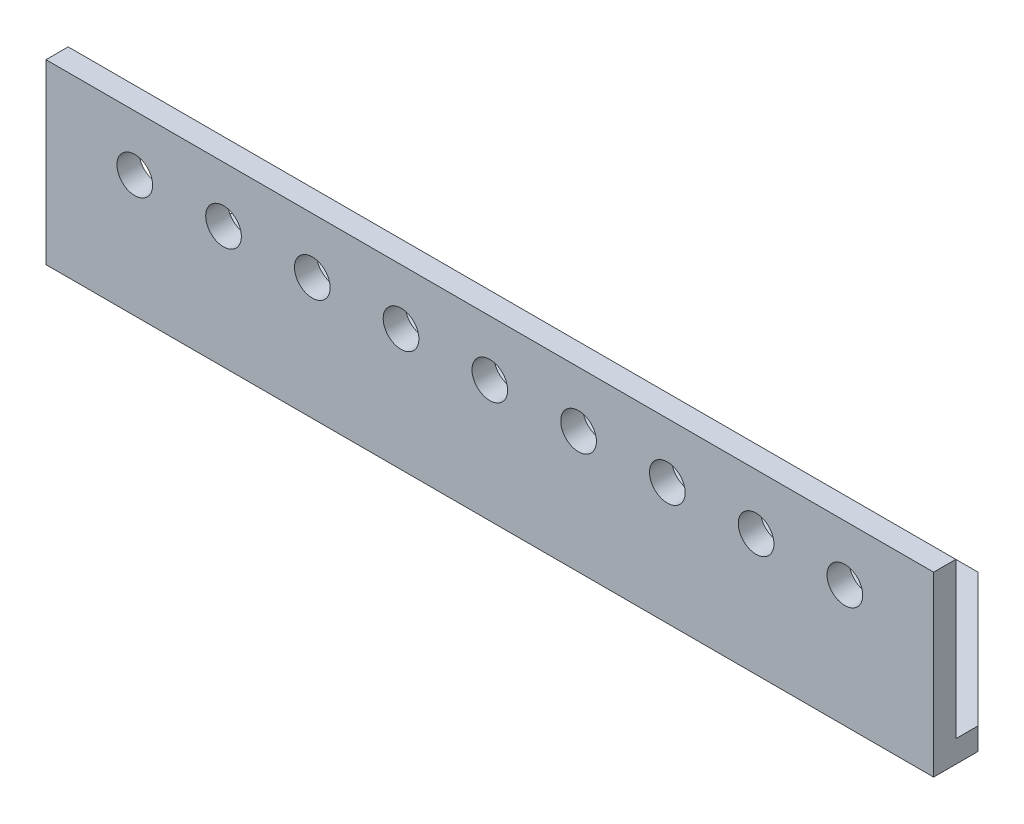
ISO-10303-21;
HEADER;
FILE_DESCRIPTION(('STEP AP214'),'2;1');
FILE_NAME('part.step','',(''),(''),'','','');
FILE_SCHEMA(('AUTOMOTIVE_DESIGN { 1 0 10303 214 1 1 1 1 }'));
ENDSEC;
DATA;
#1=APPLICATION_CONTEXT('core data for automotive mechanical design processes');
#2=APPLICATION_PROTOCOL_DEFINITION('international standard','automotive_design',2000,#1);
#3=PRODUCT_CONTEXT('',#1,'mechanical');
#4=PRODUCT('Part','Part','',(#3));
#5=PRODUCT_RELATED_PRODUCT_CATEGORY('part','',(#4));
#6=PRODUCT_DEFINITION_FORMATION('','',#4);
#7=PRODUCT_DEFINITION_CONTEXT('part definition',#1,'design');
#8=PRODUCT_DEFINITION('design','',#6,#7);
#9=PRODUCT_DEFINITION_SHAPE('','',#8);
#10=(LENGTH_UNIT() NAMED_UNIT(*) SI_UNIT(.MILLI.,.METRE.));
#11=(NAMED_UNIT(*) PLANE_ANGLE_UNIT() SI_UNIT($,.RADIAN.));
#12=(NAMED_UNIT(*) SI_UNIT($,.STERADIAN.) SOLID_ANGLE_UNIT());
#13=UNCERTAINTY_MEASURE_WITH_UNIT(LENGTH_MEASURE(1.E-05),#10,'distance_accuracy_value','');
#14=(GEOMETRIC_REPRESENTATION_CONTEXT(3) GLOBAL_UNCERTAINTY_ASSIGNED_CONTEXT((#13)) GLOBAL_UNIT_ASSIGNED_CONTEXT((#10,
#11,#12)) REPRESENTATION_CONTEXT('',''));
#15=CARTESIAN_POINT('',(0.,0.,0.));
#16=DIRECTION('',(0.,0.,1.));
#17=DIRECTION('',(1.,0.,0.));
#18=AXIS2_PLACEMENT_3D('',#15,#16,#17);
#19=CARTESIAN_POINT('',(0.,3.175,0.));
#20=DIRECTION('',(0.,1.,0.));
#21=DIRECTION('',(0.,0.,1.));
#22=AXIS2_PLACEMENT_3D('',#19,#20,#21);
#23=PLANE('',#22);
#24=DIRECTION('',(0.707106781186548,0.,-0.707106781186547));
#25=VECTOR('',#24,1.);
#26=CARTESIAN_POINT('',(-38.1,3.175,-12.6999999999997));
#27=LINE('',#26,#25);
#28=CARTESIAN_POINT('',(-57.15,3.175,6.35000000000027));
#29=VERTEX_POINT('',#28);
#30=CARTESIAN_POINT('',(-38.1,3.175,-12.6999999999997));
#31=VERTEX_POINT('',#30);
#32=EDGE_CURVE('E54',#29,#31,#27,.T.);
#33=ORIENTED_EDGE('',*,*,#32,.F.);
#34=DIRECTION('',(0.,0.,1.));
#35=VECTOR('',#34,1.);
#36=CARTESIAN_POINT('',(-57.15,3.175,-12.6999999999997));
#37=LINE('',#36,#35);
#38=CARTESIAN_POINT('',(-57.15,3.175,9.52500000000027));
#39=VERTEX_POINT('',#38);
#40=EDGE_CURVE('E117',#29,#39,#37,.T.);
#41=ORIENTED_EDGE('',*,*,#40,.T.);
#42=DIRECTION('',(1.,0.,0.));
#43=VECTOR('',#42,1.);
#44=CARTESIAN_POINT('',(-57.15,3.175,9.52500000000027));
#45=LINE('',#44,#43);
#46=CARTESIAN_POINT('',(69.85,3.175,9.52500000000027));
#47=VERTEX_POINT('',#46);
#48=EDGE_CURVE('E210',#39,#47,#45,.T.);
#49=ORIENTED_EDGE('',*,*,#48,.T.);
#50=DIRECTION('',(0.,0.,-1.));
#51=VECTOR('',#50,1.);
#52=CARTESIAN_POINT('',(69.85,3.175,-12.6999999999997));
#53=LINE('',#52,#51);
#54=CARTESIAN_POINT('',(69.85,3.175,6.35000000000027));
#55=VERTEX_POINT('',#54);
#56=EDGE_CURVE('E141',#47,#55,#53,.T.);
#57=ORIENTED_EDGE('',*,*,#56,.T.);
#58=DIRECTION('',(0.707106781186547,0.,0.707106781186547));
#59=VECTOR('',#58,1.);
#60=CARTESIAN_POINT('',(50.8,3.175,-12.6999999999997));
#61=LINE('',#60,#59);
#62=CARTESIAN_POINT('',(50.8,3.175,-12.6999999999997));
#63=VERTEX_POINT('',#62);
#64=EDGE_CURVE('E267',#63,#55,#61,.T.);
#65=ORIENTED_EDGE('',*,*,#64,.F.);
#66=DIRECTION('',(-1.,0.,0.));
#67=VECTOR('',#66,1.);
#68=CARTESIAN_POINT('',(-57.15,3.175,-12.6999999999997));
#69=LINE('',#68,#67);
#70=EDGE_CURVE('E131',#63,#31,#69,.T.);
#71=ORIENTED_EDGE('',*,*,#70,.T.);
#72=EDGE_LOOP('',(#33,#41,#49,#57,#65,#71));
#73=FACE_BOUND('',#72,.T.);
#74=CARTESIAN_POINT('',(-38.1,3.175,2.66050878019847E-13));
#75=DIRECTION('',(0.,1.,0.));
#76=DIRECTION('',(0.,0.,1.));
#77=AXIS2_PLACEMENT_3D('',#74,#75,#76);
#78=CIRCLE('',#77,2.5527);
#79=CARTESIAN_POINT('',(-38.1,3.175,2.55270000000026));
#80=VERTEX_POINT('',#79);
#81=EDGE_CURVE('E180',#80,#80,#78,.T.);
#82=ORIENTED_EDGE('',*,*,#81,.F.);
#83=EDGE_LOOP('',(#82));
#84=FACE_BOUND('',#83,.T.);
#85=CARTESIAN_POINT('',(-12.7,3.175,0.));
#86=DIRECTION('',(0.,1.,0.));
#87=DIRECTION('',(0.,0.,1.));
#88=AXIS2_PLACEMENT_3D('',#85,#86,#87);
#89=CIRCLE('',#88,2.5527);
#90=CARTESIAN_POINT('',(-12.7,3.175,2.55270000000009));
#91=VERTEX_POINT('',#90);
#92=EDGE_CURVE('E168',#91,#91,#89,.T.);
#93=ORIENTED_EDGE('',*,*,#92,.F.);
#94=EDGE_LOOP('',(#93));
#95=FACE_BOUND('',#94,.T.);
#96=CARTESIAN_POINT('',(25.4,3.175,0.));
#97=DIRECTION('',(0.,1.,0.));
#98=DIRECTION('',(0.,0.,1.));
#99=AXIS2_PLACEMENT_3D('',#96,#97,#98);
#100=CIRCLE('',#99,2.5527);
#101=CARTESIAN_POINT('',(25.4,3.175,2.5527));
#102=VERTEX_POINT('',#101);
#103=EDGE_CURVE('E156',#102,#102,#100,.T.);
#104=ORIENTED_EDGE('',*,*,#103,.F.);
#105=EDGE_LOOP('',(#104));
#106=FACE_BOUND('',#105,.T.);
#107=CARTESIAN_POINT('',(0.,3.175,0.));
#108=DIRECTION('',(0.,1.,0.));
#109=DIRECTION('',(0.,0.,1.));
#110=AXIS2_PLACEMENT_3D('',#107,#108,#109);
#111=CIRCLE('',#110,2.5527);
#112=CARTESIAN_POINT('',(0.,3.175,2.5527));
#113=VERTEX_POINT('',#112);
#114=EDGE_CURVE('E123',#113,#113,#111,.T.);
#115=ORIENTED_EDGE('',*,*,#114,.F.);
#116=EDGE_LOOP('',(#115));
#117=FACE_BOUND('',#116,.T.);
#118=CARTESIAN_POINT('',(12.7,3.175,0.));
#119=DIRECTION('',(0.,1.,0.));
#120=DIRECTION('',(0.,0.,1.));
#121=AXIS2_PLACEMENT_3D('',#118,#119,#120);
#122=CIRCLE('',#121,2.5527);
#123=CARTESIAN_POINT('',(12.7,3.175,2.5527));
#124=VERTEX_POINT('',#123);
#125=EDGE_CURVE('E151',#124,#124,#122,.T.);
#126=ORIENTED_EDGE('',*,*,#125,.F.);
#127=EDGE_LOOP('',(#126));
#128=FACE_BOUND('',#127,.T.);
#129=CARTESIAN_POINT('',(38.1,3.175,0.));
#130=DIRECTION('',(0.,1.,0.));
#131=DIRECTION('',(0.,0.,1.));
#132=AXIS2_PLACEMENT_3D('',#129,#130,#131);
#133=CIRCLE('',#132,2.5527);
#134=CARTESIAN_POINT('',(38.1,3.175,2.5527));
#135=VERTEX_POINT('',#134);
#136=EDGE_CURVE('E162',#135,#135,#133,.T.);
#137=ORIENTED_EDGE('',*,*,#136,.F.);
#138=EDGE_LOOP('',(#137));
#139=FACE_BOUND('',#138,.T.);
#140=CARTESIAN_POINT('',(-25.4,3.175,1.77367252013231E-13));
#141=DIRECTION('',(0.,1.,0.));
#142=DIRECTION('',(0.,0.,1.));
#143=AXIS2_PLACEMENT_3D('',#140,#141,#142);
#144=CIRCLE('',#143,2.5527);
#145=CARTESIAN_POINT('',(-25.4,3.175,2.55270000000018));
#146=VERTEX_POINT('',#145);
#147=EDGE_CURVE('E174',#146,#146,#144,.T.);
#148=ORIENTED_EDGE('',*,*,#147,.F.);
#149=EDGE_LOOP('',(#148));
#150=FACE_BOUND('',#149,.T.);
#151=CARTESIAN_POINT('',(50.8,3.175,0.));
#152=DIRECTION('',(0.,1.,0.));
#153=DIRECTION('',(0.,0.,1.));
#154=AXIS2_PLACEMENT_3D('',#151,#152,#153);
#155=CIRCLE('',#154,2.5527);
#156=CARTESIAN_POINT('',(50.8,3.175,2.5527));
#157=VERTEX_POINT('',#156);
#158=EDGE_CURVE('E186',#157,#157,#155,.T.);
#159=ORIENTED_EDGE('',*,*,#158,.F.);
#160=EDGE_LOOP('',(#159));
#161=FACE_BOUND('',#160,.T.);
#162=ADVANCED_FACE('F39',(#73,#84,#95,#106,#117,#128,#139,#150,#161),#23,.T.);
#163=CARTESIAN_POINT('',(0.,0.,0.));
#164=DIRECTION('',(0.,1.,0.));
#165=DIRECTION('',(0.,0.,1.));
#166=AXIS2_PLACEMENT_3D('',#163,#164,#165);
#167=PLANE('',#166);
#168=DIRECTION('',(0.,0.,1.));
#169=VECTOR('',#168,1.);
#170=CARTESIAN_POINT('',(-57.15,0.,-12.6999999999997));
#171=LINE('',#170,#169);
#172=CARTESIAN_POINT('',(-57.15,0.,6.35000000000027));
#173=VERTEX_POINT('',#172);
#174=CARTESIAN_POINT('',(-57.15,0.,12.7000000000003));
#175=VERTEX_POINT('',#174);
#176=EDGE_CURVE('E114',#173,#175,#171,.T.);
#177=ORIENTED_EDGE('',*,*,#176,.F.);
#178=DIRECTION('',(0.707106781186548,0.,-0.707106781186547));
#179=VECTOR('',#178,1.);
#180=CARTESIAN_POINT('',(-38.1,0.,-12.6999999999997));
#181=LINE('',#180,#179);
#182=CARTESIAN_POINT('',(-38.1,0.,-12.6999999999997));
#183=VERTEX_POINT('',#182);
#184=EDGE_CURVE('E102',#173,#183,#181,.T.);
#185=ORIENTED_EDGE('',*,*,#184,.T.);
#186=DIRECTION('',(-1.,0.,0.));
#187=VECTOR('',#186,1.);
#188=CARTESIAN_POINT('',(-57.15,0.,-12.6999999999997));
#189=LINE('',#188,#187);
#190=CARTESIAN_POINT('',(50.8,0.,-12.6999999999997));
#191=VERTEX_POINT('',#190);
#192=EDGE_CURVE('E136',#191,#183,#189,.T.);
#193=ORIENTED_EDGE('',*,*,#192,.F.);
#194=DIRECTION('',(0.707106781186547,0.,0.707106781186547));
#195=VECTOR('',#194,1.);
#196=CARTESIAN_POINT('',(50.8,0.,-12.6999999999997));
#197=LINE('',#196,#195);
#198=CARTESIAN_POINT('',(69.85,0.,6.35000000000027));
#199=VERTEX_POINT('',#198);
#200=EDGE_CURVE('E62',#191,#199,#197,.T.);
#201=ORIENTED_EDGE('',*,*,#200,.T.);
#202=DIRECTION('',(0.,0.,-1.));
#203=VECTOR('',#202,1.);
#204=CARTESIAN_POINT('',(69.85,0.,-12.6999999999997));
#205=LINE('',#204,#203);
#206=CARTESIAN_POINT('',(69.85,0.,12.7000000000003));
#207=VERTEX_POINT('',#206);
#208=EDGE_CURVE('E125',#207,#199,#205,.T.);
#209=ORIENTED_EDGE('',*,*,#208,.F.);
#210=DIRECTION('',(1.,0.,0.));
#211=VECTOR('',#210,1.);
#212=CARTESIAN_POINT('',(-57.15,0.,12.7000000000003));
#213=LINE('',#212,#211);
#214=EDGE_CURVE('E122',#175,#207,#213,.T.);
#215=ORIENTED_EDGE('',*,*,#214,.F.);
#216=EDGE_LOOP('',(#177,#185,#193,#201,#209,#215));
#217=FACE_BOUND('',#216,.T.);
#218=CARTESIAN_POINT('',(0.,0.,0.));
#219=DIRECTION('',(0.,1.,0.));
#220=DIRECTION('',(0.,0.,1.));
#221=AXIS2_PLACEMENT_3D('',#218,#219,#220);
#222=CIRCLE('',#221,2.5527);
#223=CARTESIAN_POINT('',(0.,0.,2.5527));
#224=VERTEX_POINT('',#223);
#225=EDGE_CURVE('E128',#224,#224,#222,.T.);
#226=ORIENTED_EDGE('',*,*,#225,.T.);
#227=EDGE_LOOP('',(#226));
#228=FACE_BOUND('',#227,.T.);
#229=CARTESIAN_POINT('',(12.7,0.,0.));
#230=DIRECTION('',(0.,1.,0.));
#231=DIRECTION('',(0.,0.,1.));
#232=AXIS2_PLACEMENT_3D('',#229,#230,#231);
#233=CIRCLE('',#232,2.5527);
#234=CARTESIAN_POINT('',(12.7,0.,2.5527));
#235=VERTEX_POINT('',#234);
#236=EDGE_CURVE('E153',#235,#235,#233,.T.);
#237=ORIENTED_EDGE('',*,*,#236,.T.);
#238=EDGE_LOOP('',(#237));
#239=FACE_BOUND('',#238,.T.);
#240=CARTESIAN_POINT('',(25.4,0.,0.));
#241=DIRECTION('',(0.,1.,0.));
#242=DIRECTION('',(0.,0.,1.));
#243=AXIS2_PLACEMENT_3D('',#240,#241,#242);
#244=CIRCLE('',#243,2.5527);
#245=CARTESIAN_POINT('',(25.4,0.,2.5527));
#246=VERTEX_POINT('',#245);
#247=EDGE_CURVE('E159',#246,#246,#244,.T.);
#248=ORIENTED_EDGE('',*,*,#247,.T.);
#249=EDGE_LOOP('',(#248));
#250=FACE_BOUND('',#249,.T.);
#251=CARTESIAN_POINT('',(38.1,0.,0.));
#252=DIRECTION('',(0.,1.,0.));
#253=DIRECTION('',(0.,0.,1.));
#254=AXIS2_PLACEMENT_3D('',#251,#252,#253);
#255=CIRCLE('',#254,2.5527);
#256=CARTESIAN_POINT('',(38.1,0.,2.5527));
#257=VERTEX_POINT('',#256);
#258=EDGE_CURVE('E165',#257,#257,#255,.T.);
#259=ORIENTED_EDGE('',*,*,#258,.T.);
#260=EDGE_LOOP('',(#259));
#261=FACE_BOUND('',#260,.T.);
#262=CARTESIAN_POINT('',(-12.7,0.,0.));
#263=DIRECTION('',(0.,1.,0.));
#264=DIRECTION('',(0.,0.,1.));
#265=AXIS2_PLACEMENT_3D('',#262,#263,#264);
#266=CIRCLE('',#265,2.5527);
#267=CARTESIAN_POINT('',(-12.7,0.,2.55270000000009));
#268=VERTEX_POINT('',#267);
#269=EDGE_CURVE('E171',#268,#268,#266,.T.);
#270=ORIENTED_EDGE('',*,*,#269,.T.);
#271=EDGE_LOOP('',(#270));
#272=FACE_BOUND('',#271,.T.);
#273=CARTESIAN_POINT('',(-25.4,0.,1.77367252013231E-13));
#274=DIRECTION('',(0.,1.,0.));
#275=DIRECTION('',(0.,0.,1.));
#276=AXIS2_PLACEMENT_3D('',#273,#274,#275);
#277=CIRCLE('',#276,2.5527);
#278=CARTESIAN_POINT('',(-25.4,0.,2.55270000000018));
#279=VERTEX_POINT('',#278);
#280=EDGE_CURVE('E177',#279,#279,#277,.T.);
#281=ORIENTED_EDGE('',*,*,#280,.T.);
#282=EDGE_LOOP('',(#281));
#283=FACE_BOUND('',#282,.T.);
#284=CARTESIAN_POINT('',(-38.1,0.,2.66050878019847E-13));
#285=DIRECTION('',(0.,1.,0.));
#286=DIRECTION('',(0.,0.,1.));
#287=AXIS2_PLACEMENT_3D('',#284,#285,#286);
#288=CIRCLE('',#287,2.5527);
#289=CARTESIAN_POINT('',(-38.1,0.,2.55270000000026));
#290=VERTEX_POINT('',#289);
#291=EDGE_CURVE('E183',#290,#290,#288,.T.);
#292=ORIENTED_EDGE('',*,*,#291,.T.);
#293=EDGE_LOOP('',(#292));
#294=FACE_BOUND('',#293,.T.);
#295=CARTESIAN_POINT('',(50.8,0.,0.));
#296=DIRECTION('',(0.,1.,0.));
#297=DIRECTION('',(0.,0.,1.));
#298=AXIS2_PLACEMENT_3D('',#295,#296,#297);
#299=CIRCLE('',#298,2.5527);
#300=CARTESIAN_POINT('',(50.8,0.,2.5527));
#301=VERTEX_POINT('',#300);
#302=EDGE_CURVE('E189',#301,#301,#299,.T.);
#303=ORIENTED_EDGE('',*,*,#302,.T.);
#304=EDGE_LOOP('',(#303));
#305=FACE_BOUND('',#304,.T.);
#306=ADVANCED_FACE('F119',(#217,#228,#239,#250,#261,#272,#283,#294,#305),#167,.F.);
#307=CARTESIAN_POINT('',(-57.15,3.175,-12.6999999999997));
#308=DIRECTION('',(1.,0.,0.));
#309=DIRECTION('',(0.,0.,-1.));
#310=AXIS2_PLACEMENT_3D('',#307,#308,#309);
#311=PLANE('',#310);
#312=ORIENTED_EDGE('',*,*,#40,.F.);
#313=DIRECTION('',(0.,1.,0.));
#314=VECTOR('',#313,1.);
#315=CARTESIAN_POINT('',(-57.15,0.,6.35000000000027));
#316=LINE('',#315,#314);
#317=EDGE_CURVE('E105',#173,#29,#316,.T.);
#318=ORIENTED_EDGE('',*,*,#317,.F.);
#319=ORIENTED_EDGE('',*,*,#176,.T.);
#320=DIRECTION('',(0.,-1.,0.));
#321=VECTOR('',#320,1.);
#322=CARTESIAN_POINT('',(-57.15,3.175,12.7000000000003));
#323=LINE('',#322,#321);
#324=CARTESIAN_POINT('',(-57.15,25.4,12.7000000000003));
#325=VERTEX_POINT('',#324);
#326=EDGE_CURVE('E11',#325,#175,#323,.T.);
#327=ORIENTED_EDGE('',*,*,#326,.F.);
#328=DIRECTION('',(0.,0.,1.));
#329=VECTOR('',#328,1.);
#330=CARTESIAN_POINT('',(-57.15,25.4,9.52500000000027));
#331=LINE('',#330,#329);
#332=CARTESIAN_POINT('',(-57.15,25.4,9.52500000000027));
#333=VERTEX_POINT('',#332);
#334=EDGE_CURVE('E192',#333,#325,#331,.T.);
#335=ORIENTED_EDGE('',*,*,#334,.F.);
#336=DIRECTION('',(0.,-1.,0.));
#337=VECTOR('',#336,1.);
#338=CARTESIAN_POINT('',(-57.15,3.175,9.52500000000027));
#339=LINE('',#338,#337);
#340=EDGE_CURVE('E203',#333,#39,#339,.T.);
#341=ORIENTED_EDGE('',*,*,#340,.T.);
#342=EDGE_LOOP('',(#312,#318,#319,#327,#335,#341));
#343=FACE_BOUND('',#342,.T.);
#344=ADVANCED_FACE('F41',(#343),#311,.F.);
#345=CARTESIAN_POINT('',(-57.15,3.175,12.7000000000003));
#346=DIRECTION('',(0.,0.,-1.));
#347=DIRECTION('',(-1.,0.,0.));
#348=AXIS2_PLACEMENT_3D('',#345,#346,#347);
#349=PLANE('',#348);
#350=ORIENTED_EDGE('',*,*,#214,.T.);
#351=DIRECTION('',(0.,-1.,0.));
#352=VECTOR('',#351,1.);
#353=CARTESIAN_POINT('',(69.85,3.175,12.7000000000003));
#354=LINE('',#353,#352);
#355=CARTESIAN_POINT('',(69.85,25.4,12.7000000000003));
#356=VERTEX_POINT('',#355);
#357=EDGE_CURVE('E47',#356,#207,#354,.T.);
#358=ORIENTED_EDGE('',*,*,#357,.F.);
#359=DIRECTION('',(-1.,0.,0.));
#360=VECTOR('',#359,1.);
#361=CARTESIAN_POINT('',(-57.15,25.4,12.7000000000003));
#362=LINE('',#361,#360);
#363=EDGE_CURVE('E200',#356,#325,#362,.T.);
#364=ORIENTED_EDGE('',*,*,#363,.T.);
#365=ORIENTED_EDGE('',*,*,#326,.T.);
#366=EDGE_LOOP('',(#350,#358,#364,#365));
#367=FACE_BOUND('',#366,.T.);
#368=CARTESIAN_POINT('',(-6.35,17.4625,12.7000000000003));
#369=DIRECTION('',(0.,0.,1.));
#370=DIRECTION('',(-1.,0.,0.));
#371=AXIS2_PLACEMENT_3D('',#368,#369,#370);
#372=CIRCLE('',#371,2.5527);
#373=CARTESIAN_POINT('',(-8.90270000000001,17.4625,12.7000000000003));
#374=VERTEX_POINT('',#373);
#375=EDGE_CURVE('E261',#374,#374,#372,.T.);
#376=ORIENTED_EDGE('',*,*,#375,.F.);
#377=EDGE_LOOP('',(#376));
#378=FACE_BOUND('',#377,.T.);
#379=CARTESIAN_POINT('',(-19.05,17.4625,12.7000000000003));
#380=DIRECTION('',(0.,0.,1.));
#381=DIRECTION('',(-1.,0.,0.));
#382=AXIS2_PLACEMENT_3D('',#379,#380,#381);
#383=CIRCLE('',#382,2.5527);
#384=CARTESIAN_POINT('',(-21.6027,17.4625,12.7000000000003));
#385=VERTEX_POINT('',#384);
#386=EDGE_CURVE('E255',#385,#385,#383,.T.);
#387=ORIENTED_EDGE('',*,*,#386,.F.);
#388=EDGE_LOOP('',(#387));
#389=FACE_BOUND('',#388,.T.);
#390=CARTESIAN_POINT('',(-31.75,17.4625,12.7000000000003));
#391=DIRECTION('',(0.,0.,1.));
#392=DIRECTION('',(-1.,0.,0.));
#393=AXIS2_PLACEMENT_3D('',#390,#391,#392);
#394=CIRCLE('',#393,2.5527);
#395=CARTESIAN_POINT('',(-34.3027,17.4625,12.7000000000003));
#396=VERTEX_POINT('',#395);
#397=EDGE_CURVE('E249',#396,#396,#394,.T.);
#398=ORIENTED_EDGE('',*,*,#397,.F.);
#399=EDGE_LOOP('',(#398));
#400=FACE_BOUND('',#399,.T.);
#401=CARTESIAN_POINT('',(-44.45,17.4625,12.7000000000003));
#402=DIRECTION('',(0.,0.,1.));
#403=DIRECTION('',(-1.,0.,0.));
#404=AXIS2_PLACEMENT_3D('',#401,#402,#403);
#405=CIRCLE('',#404,2.5527);
#406=CARTESIAN_POINT('',(-47.0027,17.4625,12.7000000000003));
#407=VERTEX_POINT('',#406);
#408=EDGE_CURVE('E243',#407,#407,#405,.T.);
#409=ORIENTED_EDGE('',*,*,#408,.F.);
#410=EDGE_LOOP('',(#409));
#411=FACE_BOUND('',#410,.T.);
#412=CARTESIAN_POINT('',(57.15,17.4625,12.7000000000003));
#413=DIRECTION('',(0.,0.,1.));
#414=DIRECTION('',(1.,0.,0.));
#415=AXIS2_PLACEMENT_3D('',#412,#413,#414);
#416=CIRCLE('',#415,2.5527);
#417=CARTESIAN_POINT('',(59.7027,17.4625,12.7000000000003));
#418=VERTEX_POINT('',#417);
#419=EDGE_CURVE('E237',#418,#418,#416,.T.);
#420=ORIENTED_EDGE('',*,*,#419,.F.);
#421=EDGE_LOOP('',(#420));
#422=FACE_BOUND('',#421,.T.);
#423=CARTESIAN_POINT('',(44.45,17.4625,12.7000000000003));
#424=DIRECTION('',(0.,0.,1.));
#425=DIRECTION('',(1.,0.,0.));
#426=AXIS2_PLACEMENT_3D('',#423,#424,#425);
#427=CIRCLE('',#426,2.5527);
#428=CARTESIAN_POINT('',(47.0027,17.4625,12.7000000000003));
#429=VERTEX_POINT('',#428);
#430=EDGE_CURVE('E231',#429,#429,#427,.T.);
#431=ORIENTED_EDGE('',*,*,#430,.F.);
#432=EDGE_LOOP('',(#431));
#433=FACE_BOUND('',#432,.T.);
#434=CARTESIAN_POINT('',(19.05,17.4625,12.7000000000003));
#435=DIRECTION('',(0.,0.,1.));
#436=DIRECTION('',(1.,0.,0.));
#437=AXIS2_PLACEMENT_3D('',#434,#435,#436);
#438=CIRCLE('',#437,2.5527);
#439=CARTESIAN_POINT('',(21.6027,17.4625,12.7000000000003));
#440=VERTEX_POINT('',#439);
#441=EDGE_CURVE('E225',#440,#440,#438,.T.);
#442=ORIENTED_EDGE('',*,*,#441,.F.);
#443=EDGE_LOOP('',(#442));
#444=FACE_BOUND('',#443,.T.);
#445=CARTESIAN_POINT('',(31.75,17.4625,12.7000000000003));
#446=DIRECTION('',(0.,0.,1.));
#447=DIRECTION('',(1.,0.,0.));
#448=AXIS2_PLACEMENT_3D('',#445,#446,#447);
#449=CIRCLE('',#448,2.5527);
#450=CARTESIAN_POINT('',(34.3027,17.4625,12.7000000000003));
#451=VERTEX_POINT('',#450);
#452=EDGE_CURVE('E219',#451,#451,#449,.T.);
#453=ORIENTED_EDGE('',*,*,#452,.F.);
#454=EDGE_LOOP('',(#453));
#455=FACE_BOUND('',#454,.T.);
#456=CARTESIAN_POINT('',(6.35,17.4625,12.7000000000003));
#457=DIRECTION('',(0.,0.,1.));
#458=DIRECTION('',(1.,0.,0.));
#459=AXIS2_PLACEMENT_3D('',#456,#457,#458);
#460=CIRCLE('',#459,2.5527);
#461=CARTESIAN_POINT('',(8.9027,17.4625,12.7000000000003));
#462=VERTEX_POINT('',#461);
#463=EDGE_CURVE('E213',#462,#462,#460,.T.);
#464=ORIENTED_EDGE('',*,*,#463,.F.);
#465=EDGE_LOOP('',(#464));
#466=FACE_BOUND('',#465,.T.);
#467=ADVANCED_FACE('F311',(#367,#378,#389,#400,#411,#422,#433,#444,#455,#466),#349,.F.);
#468=CARTESIAN_POINT('',(69.85,3.175,-12.6999999999997));
#469=DIRECTION('',(-1.,0.,0.));
#470=DIRECTION('',(0.,0.,1.));
#471=AXIS2_PLACEMENT_3D('',#468,#469,#470);
#472=PLANE('',#471);
#473=ORIENTED_EDGE('',*,*,#208,.T.);
#474=DIRECTION('',(0.,1.,0.));
#475=VECTOR('',#474,1.);
#476=CARTESIAN_POINT('',(69.85,0.,6.35000000000027));
#477=LINE('',#476,#475);
#478=EDGE_CURVE('E270',#199,#55,#477,.T.);
#479=ORIENTED_EDGE('',*,*,#478,.T.);
#480=ORIENTED_EDGE('',*,*,#56,.F.);
#481=DIRECTION('',(0.,1.,0.));
#482=VECTOR('',#481,1.);
#483=CARTESIAN_POINT('',(69.85,3.175,9.52500000000027));
#484=LINE('',#483,#482);
#485=CARTESIAN_POINT('',(69.85,25.4,9.52500000000027));
#486=VERTEX_POINT('',#485);
#487=EDGE_CURVE('E207',#47,#486,#484,.T.);
#488=ORIENTED_EDGE('',*,*,#487,.T.);
#489=DIRECTION('',(0.,0.,1.));
#490=VECTOR('',#489,1.);
#491=CARTESIAN_POINT('',(69.85,25.4,9.52500000000027));
#492=LINE('',#491,#490);
#493=EDGE_CURVE('E195',#486,#356,#492,.T.);
#494=ORIENTED_EDGE('',*,*,#493,.T.);
#495=ORIENTED_EDGE('',*,*,#357,.T.);
#496=EDGE_LOOP('',(#473,#479,#480,#488,#494,#495));
#497=FACE_BOUND('',#496,.T.);
#498=ADVANCED_FACE('F277',(#497),#472,.F.);
#499=CARTESIAN_POINT('',(-57.15,3.175,-12.6999999999997));
#500=DIRECTION('',(0.,0.,1.));
#501=DIRECTION('',(1.,0.,0.));
#502=AXIS2_PLACEMENT_3D('',#499,#500,#501);
#503=PLANE('',#502);
#504=ORIENTED_EDGE('',*,*,#192,.T.);
#505=DIRECTION('',(0.,1.,0.));
#506=VECTOR('',#505,1.);
#507=CARTESIAN_POINT('',(-38.1,0.,-12.6999999999997));
#508=LINE('',#507,#506);
#509=EDGE_CURVE('E106',#183,#31,#508,.T.);
#510=ORIENTED_EDGE('',*,*,#509,.T.);
#511=ORIENTED_EDGE('',*,*,#70,.F.);
#512=DIRECTION('',(0.,1.,0.));
#513=VECTOR('',#512,1.);
#514=CARTESIAN_POINT('',(50.8,0.,-12.6999999999997));
#515=LINE('',#514,#513);
#516=EDGE_CURVE('E268',#191,#63,#515,.T.);
#517=ORIENTED_EDGE('',*,*,#516,.F.);
#518=EDGE_LOOP('',(#504,#510,#511,#517));
#519=FACE_BOUND('',#518,.T.);
#520=ADVANCED_FACE('F276',(#519),#503,.F.);
#521=CARTESIAN_POINT('',(0.,3.175,0.));
#522=DIRECTION('',(0.,-1.,0.));
#523=DIRECTION('',(0.,0.,-1.));
#524=AXIS2_PLACEMENT_3D('',#521,#522,#523);
#525=CYLINDRICAL_SURFACE('',#524,2.5527);
#526=ORIENTED_EDGE('',*,*,#114,.T.);
#527=EDGE_LOOP('',(#526));
#528=FACE_BOUND('',#527,.T.);
#529=ORIENTED_EDGE('',*,*,#225,.F.);
#530=EDGE_LOOP('',(#529));
#531=FACE_BOUND('',#530,.T.);
#532=ADVANCED_FACE('F316',(#528,#531),#525,.F.);
#533=CARTESIAN_POINT('',(12.7,3.175,0.));
#534=DIRECTION('',(0.,-1.,0.));
#535=DIRECTION('',(0.,0.,-1.));
#536=AXIS2_PLACEMENT_3D('',#533,#534,#535);
#537=CYLINDRICAL_SURFACE('',#536,2.5527);
#538=ORIENTED_EDGE('',*,*,#125,.T.);
#539=EDGE_LOOP('',(#538));
#540=FACE_BOUND('',#539,.T.);
#541=ORIENTED_EDGE('',*,*,#236,.F.);
#542=EDGE_LOOP('',(#541));
#543=FACE_BOUND('',#542,.T.);
#544=ADVANCED_FACE('F380',(#540,#543),#537,.F.);
#545=CARTESIAN_POINT('',(25.4,3.175,0.));
#546=DIRECTION('',(0.,-1.,0.));
#547=DIRECTION('',(0.,0.,-1.));
#548=AXIS2_PLACEMENT_3D('',#545,#546,#547);
#549=CYLINDRICAL_SURFACE('',#548,2.5527);
#550=ORIENTED_EDGE('',*,*,#103,.T.);
#551=EDGE_LOOP('',(#550));
#552=FACE_BOUND('',#551,.T.);
#553=ORIENTED_EDGE('',*,*,#247,.F.);
#554=EDGE_LOOP('',(#553));
#555=FACE_BOUND('',#554,.T.);
#556=ADVANCED_FACE('F376',(#552,#555),#549,.F.);
#557=CARTESIAN_POINT('',(38.1,3.175,0.));
#558=DIRECTION('',(0.,-1.,0.));
#559=DIRECTION('',(0.,0.,-1.));
#560=AXIS2_PLACEMENT_3D('',#557,#558,#559);
#561=CYLINDRICAL_SURFACE('',#560,2.5527);
#562=ORIENTED_EDGE('',*,*,#136,.T.);
#563=EDGE_LOOP('',(#562));
#564=FACE_BOUND('',#563,.T.);
#565=ORIENTED_EDGE('',*,*,#258,.F.);
#566=EDGE_LOOP('',(#565));
#567=FACE_BOUND('',#566,.T.);
#568=ADVANCED_FACE('F372',(#564,#567),#561,.F.);
#569=CARTESIAN_POINT('',(-12.7,3.175,0.));
#570=DIRECTION('',(0.,-1.,0.));
#571=DIRECTION('',(0.,0.,-1.));
#572=AXIS2_PLACEMENT_3D('',#569,#570,#571);
#573=CYLINDRICAL_SURFACE('',#572,2.5527);
#574=ORIENTED_EDGE('',*,*,#92,.T.);
#575=EDGE_LOOP('',(#574));
#576=FACE_BOUND('',#575,.T.);
#577=ORIENTED_EDGE('',*,*,#269,.F.);
#578=EDGE_LOOP('',(#577));
#579=FACE_BOUND('',#578,.T.);
#580=ADVANCED_FACE('F368',(#576,#579),#573,.F.);
#581=CARTESIAN_POINT('',(-25.4,3.175,1.77367252013231E-13));
#582=DIRECTION('',(0.,-1.,0.));
#583=DIRECTION('',(0.,0.,-1.));
#584=AXIS2_PLACEMENT_3D('',#581,#582,#583);
#585=CYLINDRICAL_SURFACE('',#584,2.5527);
#586=ORIENTED_EDGE('',*,*,#147,.T.);
#587=EDGE_LOOP('',(#586));
#588=FACE_BOUND('',#587,.T.);
#589=ORIENTED_EDGE('',*,*,#280,.F.);
#590=EDGE_LOOP('',(#589));
#591=FACE_BOUND('',#590,.T.);
#592=ADVANCED_FACE('F364',(#588,#591),#585,.F.);
#593=CARTESIAN_POINT('',(-38.1,3.175,2.66050878019847E-13));
#594=DIRECTION('',(0.,-1.,0.));
#595=DIRECTION('',(0.,0.,-1.));
#596=AXIS2_PLACEMENT_3D('',#593,#594,#595);
#597=CYLINDRICAL_SURFACE('',#596,2.5527);
#598=ORIENTED_EDGE('',*,*,#81,.T.);
#599=EDGE_LOOP('',(#598));
#600=FACE_BOUND('',#599,.T.);
#601=ORIENTED_EDGE('',*,*,#291,.F.);
#602=EDGE_LOOP('',(#601));
#603=FACE_BOUND('',#602,.T.);
#604=ADVANCED_FACE('F302',(#600,#603),#597,.F.);
#605=CARTESIAN_POINT('',(50.8,3.175,0.));
#606=DIRECTION('',(0.,-1.,0.));
#607=DIRECTION('',(0.,0.,-1.));
#608=AXIS2_PLACEMENT_3D('',#605,#606,#607);
#609=CYLINDRICAL_SURFACE('',#608,2.5527);
#610=ORIENTED_EDGE('',*,*,#158,.T.);
#611=EDGE_LOOP('',(#610));
#612=FACE_BOUND('',#611,.T.);
#613=ORIENTED_EDGE('',*,*,#302,.F.);
#614=EDGE_LOOP('',(#613));
#615=FACE_BOUND('',#614,.T.);
#616=ADVANCED_FACE('F298',(#612,#615),#609,.F.);
#617=CARTESIAN_POINT('',(-57.15,25.4,9.52500000000027));
#618=DIRECTION('',(0.,1.,0.));
#619=DIRECTION('',(0.,0.,1.));
#620=AXIS2_PLACEMENT_3D('',#617,#618,#619);
#621=PLANE('',#620);
#622=ORIENTED_EDGE('',*,*,#363,.F.);
#623=ORIENTED_EDGE('',*,*,#493,.F.);
#624=DIRECTION('',(-1.,0.,0.));
#625=VECTOR('',#624,1.);
#626=CARTESIAN_POINT('',(-57.15,25.4,9.52500000000027));
#627=LINE('',#626,#625);
#628=EDGE_CURVE('E197',#486,#333,#627,.T.);
#629=ORIENTED_EDGE('',*,*,#628,.T.);
#630=ORIENTED_EDGE('',*,*,#334,.T.);
#631=EDGE_LOOP('',(#622,#623,#629,#630));
#632=FACE_BOUND('',#631,.T.);
#633=ADVANCED_FACE('F301',(#632),#621,.T.);
#634=CARTESIAN_POINT('',(0.,0.,9.52500000000027));
#635=DIRECTION('',(0.,0.,-1.));
#636=DIRECTION('',(-1.,0.,0.));
#637=AXIS2_PLACEMENT_3D('',#634,#635,#636);
#638=PLANE('',#637);
#639=CARTESIAN_POINT('',(-6.35,17.4625,9.52500000000027));
#640=DIRECTION('',(0.,0.,1.));
#641=DIRECTION('',(-1.,0.,0.));
#642=AXIS2_PLACEMENT_3D('',#639,#640,#641);
#643=CIRCLE('',#642,2.5527);
#644=CARTESIAN_POINT('',(-8.90270000000001,17.4625,9.52500000000027));
#645=VERTEX_POINT('',#644);
#646=EDGE_CURVE('E258',#645,#645,#643,.T.);
#647=ORIENTED_EDGE('',*,*,#646,.T.);
#648=EDGE_LOOP('',(#647));
#649=FACE_BOUND('',#648,.T.);
#650=CARTESIAN_POINT('',(-19.05,17.4625,9.52500000000027));
#651=DIRECTION('',(0.,0.,1.));
#652=DIRECTION('',(-1.,0.,0.));
#653=AXIS2_PLACEMENT_3D('',#650,#651,#652);
#654=CIRCLE('',#653,2.5527);
#655=CARTESIAN_POINT('',(-21.6027,17.4625,9.52500000000027));
#656=VERTEX_POINT('',#655);
#657=EDGE_CURVE('E252',#656,#656,#654,.T.);
#658=ORIENTED_EDGE('',*,*,#657,.T.);
#659=EDGE_LOOP('',(#658));
#660=FACE_BOUND('',#659,.T.);
#661=CARTESIAN_POINT('',(-31.75,17.4625,9.52500000000027));
#662=DIRECTION('',(0.,0.,1.));
#663=DIRECTION('',(-1.,0.,0.));
#664=AXIS2_PLACEMENT_3D('',#661,#662,#663);
#665=CIRCLE('',#664,2.5527);
#666=CARTESIAN_POINT('',(-34.3027,17.4625,9.52500000000027));
#667=VERTEX_POINT('',#666);
#668=EDGE_CURVE('E246',#667,#667,#665,.T.);
#669=ORIENTED_EDGE('',*,*,#668,.T.);
#670=EDGE_LOOP('',(#669));
#671=FACE_BOUND('',#670,.T.);
#672=CARTESIAN_POINT('',(-44.45,17.4625,9.52500000000027));
#673=DIRECTION('',(0.,0.,1.));
#674=DIRECTION('',(-1.,0.,0.));
#675=AXIS2_PLACEMENT_3D('',#672,#673,#674);
#676=CIRCLE('',#675,2.5527);
#677=CARTESIAN_POINT('',(-47.0027,17.4625,9.52500000000027));
#678=VERTEX_POINT('',#677);
#679=EDGE_CURVE('E240',#678,#678,#676,.T.);
#680=ORIENTED_EDGE('',*,*,#679,.T.);
#681=EDGE_LOOP('',(#680));
#682=FACE_BOUND('',#681,.T.);
#683=CARTESIAN_POINT('',(57.15,17.4625,9.52500000000027));
#684=DIRECTION('',(0.,0.,1.));
#685=DIRECTION('',(1.,0.,0.));
#686=AXIS2_PLACEMENT_3D('',#683,#684,#685);
#687=CIRCLE('',#686,2.5527);
#688=CARTESIAN_POINT('',(59.7027,17.4625,9.52500000000027));
#689=VERTEX_POINT('',#688);
#690=EDGE_CURVE('E234',#689,#689,#687,.T.);
#691=ORIENTED_EDGE('',*,*,#690,.T.);
#692=EDGE_LOOP('',(#691));
#693=FACE_BOUND('',#692,.T.);
#694=CARTESIAN_POINT('',(44.45,17.4625,9.52500000000027));
#695=DIRECTION('',(0.,0.,1.));
#696=DIRECTION('',(1.,0.,0.));
#697=AXIS2_PLACEMENT_3D('',#694,#695,#696);
#698=CIRCLE('',#697,2.5527);
#699=CARTESIAN_POINT('',(47.0027,17.4625,9.52500000000027));
#700=VERTEX_POINT('',#699);
#701=EDGE_CURVE('E228',#700,#700,#698,.T.);
#702=ORIENTED_EDGE('',*,*,#701,.T.);
#703=EDGE_LOOP('',(#702));
#704=FACE_BOUND('',#703,.T.);
#705=CARTESIAN_POINT('',(19.05,17.4625,9.52500000000027));
#706=DIRECTION('',(0.,0.,1.));
#707=DIRECTION('',(1.,0.,0.));
#708=AXIS2_PLACEMENT_3D('',#705,#706,#707);
#709=CIRCLE('',#708,2.5527);
#710=CARTESIAN_POINT('',(21.6027,17.4625,9.52500000000027));
#711=VERTEX_POINT('',#710);
#712=EDGE_CURVE('E222',#711,#711,#709,.T.);
#713=ORIENTED_EDGE('',*,*,#712,.T.);
#714=EDGE_LOOP('',(#713));
#715=FACE_BOUND('',#714,.T.);
#716=CARTESIAN_POINT('',(31.75,17.4625,9.52500000000027));
#717=DIRECTION('',(0.,0.,1.));
#718=DIRECTION('',(1.,0.,0.));
#719=AXIS2_PLACEMENT_3D('',#716,#717,#718);
#720=CIRCLE('',#719,2.5527);
#721=CARTESIAN_POINT('',(34.3027,17.4625,9.52500000000027));
#722=VERTEX_POINT('',#721);
#723=EDGE_CURVE('E216',#722,#722,#720,.T.);
#724=ORIENTED_EDGE('',*,*,#723,.T.);
#725=EDGE_LOOP('',(#724));
#726=FACE_BOUND('',#725,.T.);
#727=CARTESIAN_POINT('',(6.35,17.4625,9.52500000000027));
#728=DIRECTION('',(0.,0.,1.));
#729=DIRECTION('',(1.,0.,0.));
#730=AXIS2_PLACEMENT_3D('',#727,#728,#729);
#731=CIRCLE('',#730,2.5527);
#732=CARTESIAN_POINT('',(8.9027,17.4625,9.52500000000027));
#733=VERTEX_POINT('',#732);
#734=EDGE_CURVE('E204',#733,#733,#731,.T.);
#735=ORIENTED_EDGE('',*,*,#734,.T.);
#736=EDGE_LOOP('',(#735));
#737=FACE_BOUND('',#736,.T.);
#738=ORIENTED_EDGE('',*,*,#340,.F.);
#739=ORIENTED_EDGE('',*,*,#628,.F.);
#740=ORIENTED_EDGE('',*,*,#487,.F.);
#741=ORIENTED_EDGE('',*,*,#48,.F.);
#742=EDGE_LOOP('',(#738,#739,#740,#741));
#743=FACE_BOUND('',#742,.T.);
#744=ADVANCED_FACE('F345',(#649,#660,#671,#682,#693,#704,#715,#726,#737,#743),#638,.T.);
#745=CARTESIAN_POINT('',(6.35,17.4625,9.52500000000027));
#746=DIRECTION('',(0.,0.,1.));
#747=DIRECTION('',(1.,0.,0.));
#748=AXIS2_PLACEMENT_3D('',#745,#746,#747);
#749=CYLINDRICAL_SURFACE('',#748,2.5527);
#750=ORIENTED_EDGE('',*,*,#734,.F.);
#751=EDGE_LOOP('',(#750));
#752=FACE_BOUND('',#751,.T.);
#753=ORIENTED_EDGE('',*,*,#463,.T.);
#754=EDGE_LOOP('',(#753));
#755=FACE_BOUND('',#754,.T.);
#756=ADVANCED_FACE('F342',(#752,#755),#749,.F.);
#757=CARTESIAN_POINT('',(31.75,17.4625,9.52500000000027));
#758=DIRECTION('',(0.,0.,1.));
#759=DIRECTION('',(1.,0.,0.));
#760=AXIS2_PLACEMENT_3D('',#757,#758,#759);
#761=CYLINDRICAL_SURFACE('',#760,2.5527);
#762=ORIENTED_EDGE('',*,*,#723,.F.);
#763=EDGE_LOOP('',(#762));
#764=FACE_BOUND('',#763,.T.);
#765=ORIENTED_EDGE('',*,*,#452,.T.);
#766=EDGE_LOOP('',(#765));
#767=FACE_BOUND('',#766,.T.);
#768=ADVANCED_FACE('F344',(#764,#767),#761,.F.);
#769=CARTESIAN_POINT('',(19.05,17.4625,9.52500000000027));
#770=DIRECTION('',(0.,0.,1.));
#771=DIRECTION('',(1.,0.,0.));
#772=AXIS2_PLACEMENT_3D('',#769,#770,#771);
#773=CYLINDRICAL_SURFACE('',#772,2.5527);
#774=ORIENTED_EDGE('',*,*,#712,.F.);
#775=EDGE_LOOP('',(#774));
#776=FACE_BOUND('',#775,.T.);
#777=ORIENTED_EDGE('',*,*,#441,.T.);
#778=EDGE_LOOP('',(#777));
#779=FACE_BOUND('',#778,.T.);
#780=ADVANCED_FACE('F352',(#776,#779),#773,.F.);
#781=CARTESIAN_POINT('',(44.45,17.4625,9.52500000000027));
#782=DIRECTION('',(0.,0.,1.));
#783=DIRECTION('',(1.,0.,0.));
#784=AXIS2_PLACEMENT_3D('',#781,#782,#783);
#785=CYLINDRICAL_SURFACE('',#784,2.5527);
#786=ORIENTED_EDGE('',*,*,#701,.F.);
#787=EDGE_LOOP('',(#786));
#788=FACE_BOUND('',#787,.T.);
#789=ORIENTED_EDGE('',*,*,#430,.T.);
#790=EDGE_LOOP('',(#789));
#791=FACE_BOUND('',#790,.T.);
#792=ADVANCED_FACE('F503',(#788,#791),#785,.F.);
#793=CARTESIAN_POINT('',(57.15,17.4625,9.52500000000027));
#794=DIRECTION('',(0.,0.,1.));
#795=DIRECTION('',(1.,0.,0.));
#796=AXIS2_PLACEMENT_3D('',#793,#794,#795);
#797=CYLINDRICAL_SURFACE('',#796,2.5527);
#798=ORIENTED_EDGE('',*,*,#690,.F.);
#799=EDGE_LOOP('',(#798));
#800=FACE_BOUND('',#799,.T.);
#801=ORIENTED_EDGE('',*,*,#419,.T.);
#802=EDGE_LOOP('',(#801));
#803=FACE_BOUND('',#802,.T.);
#804=ADVANCED_FACE('F512',(#800,#803),#797,.F.);
#805=CARTESIAN_POINT('',(-44.45,17.4625,9.52500000000027));
#806=DIRECTION('',(0.,0.,1.));
#807=DIRECTION('',(1.,0.,0.));
#808=AXIS2_PLACEMENT_3D('',#805,#806,#807);
#809=CYLINDRICAL_SURFACE('',#808,2.5527);
#810=ORIENTED_EDGE('',*,*,#679,.F.);
#811=EDGE_LOOP('',(#810));
#812=FACE_BOUND('',#811,.T.);
#813=ORIENTED_EDGE('',*,*,#408,.T.);
#814=EDGE_LOOP('',(#813));
#815=FACE_BOUND('',#814,.T.);
#816=ADVANCED_FACE('F522',(#812,#815),#809,.F.);
#817=CARTESIAN_POINT('',(-31.75,17.4625,9.52500000000027));
#818=DIRECTION('',(0.,0.,1.));
#819=DIRECTION('',(1.,0.,0.));
#820=AXIS2_PLACEMENT_3D('',#817,#818,#819);
#821=CYLINDRICAL_SURFACE('',#820,2.5527);
#822=ORIENTED_EDGE('',*,*,#668,.F.);
#823=EDGE_LOOP('',(#822));
#824=FACE_BOUND('',#823,.T.);
#825=ORIENTED_EDGE('',*,*,#397,.T.);
#826=EDGE_LOOP('',(#825));
#827=FACE_BOUND('',#826,.T.);
#828=ADVANCED_FACE('F532',(#824,#827),#821,.F.);
#829=CARTESIAN_POINT('',(-19.05,17.4625,9.52500000000027));
#830=DIRECTION('',(0.,0.,1.));
#831=DIRECTION('',(1.,0.,0.));
#832=AXIS2_PLACEMENT_3D('',#829,#830,#831);
#833=CYLINDRICAL_SURFACE('',#832,2.5527);
#834=ORIENTED_EDGE('',*,*,#657,.F.);
#835=EDGE_LOOP('',(#834));
#836=FACE_BOUND('',#835,.T.);
#837=ORIENTED_EDGE('',*,*,#386,.T.);
#838=EDGE_LOOP('',(#837));
#839=FACE_BOUND('',#838,.T.);
#840=ADVANCED_FACE('F542',(#836,#839),#833,.F.);
#841=CARTESIAN_POINT('',(-6.35,17.4625,9.52500000000027));
#842=DIRECTION('',(0.,0.,1.));
#843=DIRECTION('',(1.,0.,0.));
#844=AXIS2_PLACEMENT_3D('',#841,#842,#843);
#845=CYLINDRICAL_SURFACE('',#844,2.5527);
#846=ORIENTED_EDGE('',*,*,#646,.F.);
#847=EDGE_LOOP('',(#846));
#848=FACE_BOUND('',#847,.T.);
#849=ORIENTED_EDGE('',*,*,#375,.T.);
#850=EDGE_LOOP('',(#849));
#851=FACE_BOUND('',#850,.T.);
#852=ADVANCED_FACE('F552',(#848,#851),#845,.F.);
#853=CARTESIAN_POINT('',(50.8,0.,-12.6999999999997));
#854=DIRECTION('',(-0.707106781186548,0.,0.707106781186548));
#855=DIRECTION('',(0.707106781186547,0.,0.707106781186548));
#856=AXIS2_PLACEMENT_3D('',#853,#854,#855);
#857=PLANE('',#856);
#858=ORIENTED_EDGE('',*,*,#64,.T.);
#859=ORIENTED_EDGE('',*,*,#478,.F.);
#860=ORIENTED_EDGE('',*,*,#200,.F.);
#861=ORIENTED_EDGE('',*,*,#516,.T.);
#862=EDGE_LOOP('',(#858,#859,#860,#861));
#863=FACE_BOUND('',#862,.T.);
#864=ADVANCED_FACE('F278',(#863),#857,.F.);
#865=CARTESIAN_POINT('',(-38.1,0.,-12.6999999999997));
#866=DIRECTION('',(0.707106781186547,0.,0.707106781186548));
#867=DIRECTION('',(0.707106781186548,0.,-0.707106781186547));
#868=AXIS2_PLACEMENT_3D('',#865,#866,#867);
#869=PLANE('',#868);
#870=ORIENTED_EDGE('',*,*,#32,.T.);
#871=ORIENTED_EDGE('',*,*,#509,.F.);
#872=ORIENTED_EDGE('',*,*,#184,.F.);
#873=ORIENTED_EDGE('',*,*,#317,.T.);
#874=EDGE_LOOP('',(#870,#871,#872,#873));
#875=FACE_BOUND('',#874,.T.);
#876=ADVANCED_FACE('F104',(#875),#869,.F.);
#877=CLOSED_SHELL('',(#162,#306,#344,#467,#498,#520,#532,#544,#556,#568,#580,#592,#604,#616,
#633,#744,#756,#768,#780,#792,#804,#816,#828,#840,#852,#864,#876));
#878=MANIFOLD_SOLID_BREP('B2',#877);
#879=ADVANCED_BREP_SHAPE_REPRESENTATION('',(#18,#878),#14);
#880=SHAPE_DEFINITION_REPRESENTATION(#9,#879);
ENDSEC;
END-ISO-10303-21;
